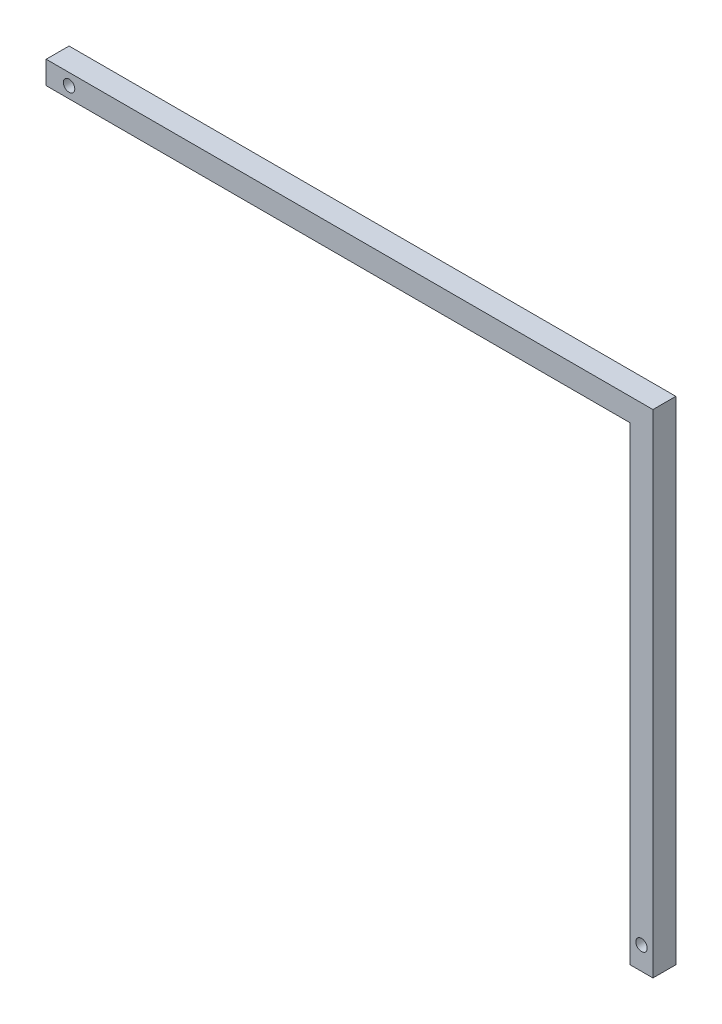
ISO-10303-21;
HEADER;
FILE_DESCRIPTION(('STEP AP214'),'2;1');
FILE_NAME('part.step','',(''),(''),'','','');
FILE_SCHEMA(('AUTOMOTIVE_DESIGN { 1 0 10303 214 1 1 1 1 }'));
ENDSEC;
DATA;
#1=APPLICATION_CONTEXT('core data for automotive mechanical design processes');
#2=APPLICATION_PROTOCOL_DEFINITION('international standard','automotive_design',2000,#1);
#3=PRODUCT_CONTEXT('',#1,'mechanical');
#4=PRODUCT('Part','Part','',(#3));
#5=PRODUCT_RELATED_PRODUCT_CATEGORY('part','',(#4));
#6=PRODUCT_DEFINITION_FORMATION('','',#4);
#7=PRODUCT_DEFINITION_CONTEXT('part definition',#1,'design');
#8=PRODUCT_DEFINITION('design','',#6,#7);
#9=PRODUCT_DEFINITION_SHAPE('','',#8);
#10=(LENGTH_UNIT() NAMED_UNIT(*) SI_UNIT(.MILLI.,.METRE.));
#11=(NAMED_UNIT(*) PLANE_ANGLE_UNIT() SI_UNIT($,.RADIAN.));
#12=(NAMED_UNIT(*) SI_UNIT($,.STERADIAN.) SOLID_ANGLE_UNIT());
#13=UNCERTAINTY_MEASURE_WITH_UNIT(LENGTH_MEASURE(1.E-05),#10,'distance_accuracy_value','');
#14=(GEOMETRIC_REPRESENTATION_CONTEXT(3) GLOBAL_UNCERTAINTY_ASSIGNED_CONTEXT((#13)) GLOBAL_UNIT_ASSIGNED_CONTEXT((#10,
#11,#12)) REPRESENTATION_CONTEXT('',''));
#15=CARTESIAN_POINT('',(0.,0.,0.));
#16=DIRECTION('',(0.,0.,1.));
#17=DIRECTION('',(1.,0.,0.));
#18=AXIS2_PLACEMENT_3D('',#15,#16,#17);
#19=CARTESIAN_POINT('',(0.,0.,0.));
#20=DIRECTION('',(0.,0.,1.));
#21=DIRECTION('',(1.,0.,0.));
#22=AXIS2_PLACEMENT_3D('',#19,#20,#21);
#23=PLANE('',#22);
#24=CARTESIAN_POINT('',(255.,-400.,0.));
#25=DIRECTION('',(0.,0.,1.));
#26=DIRECTION('',(1.,0.,0.));
#27=AXIS2_PLACEMENT_3D('',#24,#25,#26);
#28=CIRCLE('',#27,4.99999999999999);
#29=CARTESIAN_POINT('',(260.,-400.,0.));
#30=VERTEX_POINT('',#29);
#31=EDGE_CURVE('E138',#30,#30,#28,.T.);
#32=ORIENTED_EDGE('',*,*,#31,.T.);
#33=EDGE_LOOP('',(#32));
#34=FACE_BOUND('',#33,.T.);
#35=DIRECTION('',(0.,1.,0.));
#36=VECTOR('',#35,1.);
#37=CARTESIAN_POINT('',(265.,-10.,0.));
#38=LINE('',#37,#36);
#39=CARTESIAN_POINT('',(265.,-420.,0.));
#40=VERTEX_POINT('',#39);
#41=CARTESIAN_POINT('',(265.,10.,0.));
#42=VERTEX_POINT('',#41);
#43=EDGE_CURVE('E114',#40,#42,#38,.T.);
#44=ORIENTED_EDGE('',*,*,#43,.F.);
#45=DIRECTION('',(-1.,0.,0.));
#46=VECTOR('',#45,1.);
#47=CARTESIAN_POINT('',(265.,-420.,0.));
#48=LINE('',#47,#46);
#49=CARTESIAN_POINT('',(245.,-420.,0.));
#50=VERTEX_POINT('',#49);
#51=EDGE_CURVE('E128',#40,#50,#48,.T.);
#52=ORIENTED_EDGE('',*,*,#51,.T.);
#53=DIRECTION('',(0.,-1.,0.));
#54=VECTOR('',#53,1.);
#55=CARTESIAN_POINT('',(245.,10.,0.));
#56=LINE('',#55,#54);
#57=CARTESIAN_POINT('',(245.,-10.,0.));
#58=VERTEX_POINT('',#57);
#59=EDGE_CURVE('E120',#58,#50,#56,.T.);
#60=ORIENTED_EDGE('',*,*,#59,.F.);
#61=DIRECTION('',(1.,0.,0.));
#62=VECTOR('',#61,1.);
#63=CARTESIAN_POINT('',(-265.,-10.,0.));
#64=LINE('',#63,#62);
#65=CARTESIAN_POINT('',(-265.,-10.,0.));
#66=VERTEX_POINT('',#65);
#67=EDGE_CURVE('E167',#66,#58,#64,.T.);
#68=ORIENTED_EDGE('',*,*,#67,.F.);
#69=DIRECTION('',(0.,1.,0.));
#70=VECTOR('',#69,1.);
#71=CARTESIAN_POINT('',(-265.,-10.,0.));
#72=LINE('',#71,#70);
#73=CARTESIAN_POINT('',(-265.,10.,0.));
#74=VERTEX_POINT('',#73);
#75=EDGE_CURVE('E162',#66,#74,#72,.T.);
#76=ORIENTED_EDGE('',*,*,#75,.T.);
#77=DIRECTION('',(1.,0.,0.));
#78=VECTOR('',#77,1.);
#79=CARTESIAN_POINT('',(-265.,10.,0.));
#80=LINE('',#79,#78);
#81=EDGE_CURVE('E172',#74,#42,#80,.T.);
#82=ORIENTED_EDGE('',*,*,#81,.T.);
#83=EDGE_LOOP('',(#44,#52,#60,#68,#76,#82));
#84=FACE_BOUND('',#83,.T.);
#85=CARTESIAN_POINT('',(-245.,0.,0.));
#86=DIRECTION('',(0.,0.,1.));
#87=DIRECTION('',(1.,0.,0.));
#88=AXIS2_PLACEMENT_3D('',#85,#86,#87);
#89=CIRCLE('',#88,5.00000000000002);
#90=CARTESIAN_POINT('',(-240.,0.,0.));
#91=VERTEX_POINT('',#90);
#92=EDGE_CURVE('E135',#91,#91,#89,.T.);
#93=ORIENTED_EDGE('',*,*,#92,.T.);
#94=EDGE_LOOP('',(#93));
#95=FACE_BOUND('',#94,.T.);
#96=ADVANCED_FACE('F78',(#34,#84,#95),#23,.F.);
#97=CARTESIAN_POINT('',(265.,-10.,20.));
#98=DIRECTION('',(-1.,0.,0.));
#99=DIRECTION('',(0.,0.,1.));
#100=AXIS2_PLACEMENT_3D('',#97,#98,#99);
#101=PLANE('',#100);
#102=ORIENTED_EDGE('',*,*,#43,.T.);
#103=DIRECTION('',(0.,0.,-1.));
#104=VECTOR('',#103,1.);
#105=CARTESIAN_POINT('',(265.,10.,20.));
#106=LINE('',#105,#104);
#107=CARTESIAN_POINT('',(265.,10.,20.));
#108=VERTEX_POINT('',#107);
#109=EDGE_CURVE('E150',#108,#42,#106,.T.);
#110=ORIENTED_EDGE('',*,*,#109,.F.);
#111=DIRECTION('',(0.,1.,0.));
#112=VECTOR('',#111,1.);
#113=CARTESIAN_POINT('',(265.,-10.,20.));
#114=LINE('',#113,#112);
#115=CARTESIAN_POINT('',(265.,-420.,20.));
#116=VERTEX_POINT('',#115);
#117=EDGE_CURVE('E183',#116,#108,#114,.T.);
#118=ORIENTED_EDGE('',*,*,#117,.F.);
#119=DIRECTION('',(0.,0.,-1.));
#120=VECTOR('',#119,1.);
#121=CARTESIAN_POINT('',(265.,-420.,20.));
#122=LINE('',#121,#120);
#123=EDGE_CURVE('E82',#116,#40,#122,.T.);
#124=ORIENTED_EDGE('',*,*,#123,.T.);
#125=EDGE_LOOP('',(#102,#110,#118,#124));
#126=FACE_BOUND('',#125,.T.);
#127=ADVANCED_FACE('F206',(#126),#101,.F.);
#128=CARTESIAN_POINT('',(0.,0.,20.));
#129=DIRECTION('',(0.,0.,1.));
#130=DIRECTION('',(1.,0.,0.));
#131=AXIS2_PLACEMENT_3D('',#128,#129,#130);
#132=PLANE('',#131);
#133=CARTESIAN_POINT('',(255.,-400.,20.));
#134=DIRECTION('',(0.,0.,1.));
#135=DIRECTION('',(1.,0.,0.));
#136=AXIS2_PLACEMENT_3D('',#133,#134,#135);
#137=CIRCLE('',#136,4.99999999999999);
#138=CARTESIAN_POINT('',(260.,-400.,20.));
#139=VERTEX_POINT('',#138);
#140=EDGE_CURVE('E142',#139,#139,#137,.T.);
#141=ORIENTED_EDGE('',*,*,#140,.F.);
#142=EDGE_LOOP('',(#141));
#143=FACE_BOUND('',#142,.T.);
#144=ORIENTED_EDGE('',*,*,#117,.T.);
#145=DIRECTION('',(1.,0.,0.));
#146=VECTOR('',#145,1.);
#147=CARTESIAN_POINT('',(-265.,10.,20.));
#148=LINE('',#147,#146);
#149=CARTESIAN_POINT('',(-265.,10.,20.));
#150=VERTEX_POINT('',#149);
#151=EDGE_CURVE('E166',#150,#108,#148,.T.);
#152=ORIENTED_EDGE('',*,*,#151,.F.);
#153=DIRECTION('',(0.,1.,0.));
#154=VECTOR('',#153,1.);
#155=CARTESIAN_POINT('',(-265.,-10.,20.));
#156=LINE('',#155,#154);
#157=CARTESIAN_POINT('',(-265.,-10.,20.));
#158=VERTEX_POINT('',#157);
#159=EDGE_CURVE('E155',#158,#150,#156,.T.);
#160=ORIENTED_EDGE('',*,*,#159,.F.);
#161=DIRECTION('',(1.,0.,0.));
#162=VECTOR('',#161,1.);
#163=CARTESIAN_POINT('',(-265.,-10.,20.));
#164=LINE('',#163,#162);
#165=CARTESIAN_POINT('',(245.,-10.,20.));
#166=VERTEX_POINT('',#165);
#167=EDGE_CURVE('E179',#158,#166,#164,.T.);
#168=ORIENTED_EDGE('',*,*,#167,.T.);
#169=DIRECTION('',(0.,-1.,0.));
#170=VECTOR('',#169,1.);
#171=CARTESIAN_POINT('',(245.,10.,20.));
#172=LINE('',#171,#170);
#173=CARTESIAN_POINT('',(245.,-420.,20.));
#174=VERTEX_POINT('',#173);
#175=EDGE_CURVE('E145',#166,#174,#172,.T.);
#176=ORIENTED_EDGE('',*,*,#175,.T.);
#177=DIRECTION('',(-1.,0.,0.));
#178=VECTOR('',#177,1.);
#179=CARTESIAN_POINT('',(265.,-420.,20.));
#180=LINE('',#179,#178);
#181=EDGE_CURVE('E127',#116,#174,#180,.T.);
#182=ORIENTED_EDGE('',*,*,#181,.F.);
#183=EDGE_LOOP('',(#144,#152,#160,#168,#176,#182));
#184=FACE_BOUND('',#183,.T.);
#185=CARTESIAN_POINT('',(-245.,0.,20.));
#186=DIRECTION('',(0.,0.,1.));
#187=DIRECTION('',(1.,0.,0.));
#188=AXIS2_PLACEMENT_3D('',#185,#186,#187);
#189=CIRCLE('',#188,5.00000000000002);
#190=CARTESIAN_POINT('',(-240.,0.,20.));
#191=VERTEX_POINT('',#190);
#192=EDGE_CURVE('E175',#191,#191,#189,.T.);
#193=ORIENTED_EDGE('',*,*,#192,.F.);
#194=EDGE_LOOP('',(#193));
#195=FACE_BOUND('',#194,.T.);
#196=ADVANCED_FACE('F202',(#143,#184,#195),#132,.T.);
#197=CARTESIAN_POINT('',(-265.,10.,20.));
#198=DIRECTION('',(0.,1.,0.));
#199=DIRECTION('',(0.,0.,1.));
#200=AXIS2_PLACEMENT_3D('',#197,#198,#199);
#201=PLANE('',#200);
#202=ORIENTED_EDGE('',*,*,#109,.T.);
#203=ORIENTED_EDGE('',*,*,#81,.F.);
#204=DIRECTION('',(0.,0.,-1.));
#205=VECTOR('',#204,1.);
#206=CARTESIAN_POINT('',(-265.,10.,20.));
#207=LINE('',#206,#205);
#208=EDGE_CURVE('E89',#150,#74,#207,.T.);
#209=ORIENTED_EDGE('',*,*,#208,.F.);
#210=ORIENTED_EDGE('',*,*,#151,.T.);
#211=EDGE_LOOP('',(#202,#203,#209,#210));
#212=FACE_BOUND('',#211,.T.);
#213=ADVANCED_FACE('F205',(#212),#201,.T.);
#214=CARTESIAN_POINT('',(245.,10.,20.));
#215=DIRECTION('',(1.,0.,0.));
#216=DIRECTION('',(0.,1.,0.));
#217=AXIS2_PLACEMENT_3D('',#214,#215,#216);
#218=PLANE('',#217);
#219=ORIENTED_EDGE('',*,*,#175,.F.);
#220=DIRECTION('',(0.,0.,-1.));
#221=VECTOR('',#220,1.);
#222=CARTESIAN_POINT('',(245.,-10.,20.));
#223=LINE('',#222,#221);
#224=EDGE_CURVE('E12',#166,#58,#223,.T.);
#225=ORIENTED_EDGE('',*,*,#224,.T.);
#226=ORIENTED_EDGE('',*,*,#59,.T.);
#227=DIRECTION('',(0.,0.,-1.));
#228=VECTOR('',#227,1.);
#229=CARTESIAN_POINT('',(245.,-420.,20.));
#230=LINE('',#229,#228);
#231=EDGE_CURVE('E123',#174,#50,#230,.T.);
#232=ORIENTED_EDGE('',*,*,#231,.F.);
#233=EDGE_LOOP('',(#219,#225,#226,#232));
#234=FACE_BOUND('',#233,.T.);
#235=ADVANCED_FACE('F122',(#234),#218,.F.);
#236=CARTESIAN_POINT('',(265.,-420.,20.));
#237=DIRECTION('',(0.,-1.,0.));
#238=DIRECTION('',(0.,0.,-1.));
#239=AXIS2_PLACEMENT_3D('',#236,#237,#238);
#240=PLANE('',#239);
#241=ORIENTED_EDGE('',*,*,#51,.F.);
#242=ORIENTED_EDGE('',*,*,#123,.F.);
#243=ORIENTED_EDGE('',*,*,#181,.T.);
#244=ORIENTED_EDGE('',*,*,#231,.T.);
#245=EDGE_LOOP('',(#241,#242,#243,#244));
#246=FACE_BOUND('',#245,.T.);
#247=ADVANCED_FACE('F80',(#246),#240,.T.);
#248=CARTESIAN_POINT('',(-265.,-10.,20.));
#249=DIRECTION('',(0.,1.,0.));
#250=DIRECTION('',(0.,0.,1.));
#251=AXIS2_PLACEMENT_3D('',#248,#249,#250);
#252=PLANE('',#251);
#253=ORIENTED_EDGE('',*,*,#224,.F.);
#254=ORIENTED_EDGE('',*,*,#167,.F.);
#255=DIRECTION('',(0.,0.,-1.));
#256=VECTOR('',#255,1.);
#257=CARTESIAN_POINT('',(-265.,-10.,20.));
#258=LINE('',#257,#256);
#259=EDGE_CURVE('E154',#158,#66,#258,.T.);
#260=ORIENTED_EDGE('',*,*,#259,.T.);
#261=ORIENTED_EDGE('',*,*,#67,.T.);
#262=EDGE_LOOP('',(#253,#254,#260,#261));
#263=FACE_BOUND('',#262,.T.);
#264=ADVANCED_FACE('F231',(#263),#252,.F.);
#265=CARTESIAN_POINT('',(-265.,-10.,20.));
#266=DIRECTION('',(-1.,0.,0.));
#267=DIRECTION('',(0.,0.,1.));
#268=AXIS2_PLACEMENT_3D('',#265,#266,#267);
#269=PLANE('',#268);
#270=ORIENTED_EDGE('',*,*,#75,.F.);
#271=ORIENTED_EDGE('',*,*,#259,.F.);
#272=ORIENTED_EDGE('',*,*,#159,.T.);
#273=ORIENTED_EDGE('',*,*,#208,.T.);
#274=EDGE_LOOP('',(#270,#271,#272,#273));
#275=FACE_BOUND('',#274,.T.);
#276=ADVANCED_FACE('F217',(#275),#269,.T.);
#277=CARTESIAN_POINT('',(-245.,0.,20.));
#278=DIRECTION('',(0.,0.,-1.));
#279=DIRECTION('',(-1.,0.,0.));
#280=AXIS2_PLACEMENT_3D('',#277,#278,#279);
#281=CYLINDRICAL_SURFACE('',#280,5.00000000000002);
#282=ORIENTED_EDGE('',*,*,#192,.T.);
#283=EDGE_LOOP('',(#282));
#284=FACE_BOUND('',#283,.T.);
#285=ORIENTED_EDGE('',*,*,#92,.F.);
#286=EDGE_LOOP('',(#285));
#287=FACE_BOUND('',#286,.T.);
#288=ADVANCED_FACE('F214',(#284,#287),#281,.F.);
#289=CARTESIAN_POINT('',(255.,-400.,0.));
#290=DIRECTION('',(0.,0.,1.));
#291=DIRECTION('',(1.,0.,0.));
#292=AXIS2_PLACEMENT_3D('',#289,#290,#291);
#293=CYLINDRICAL_SURFACE('',#292,4.99999999999999);
#294=ORIENTED_EDGE('',*,*,#31,.F.);
#295=EDGE_LOOP('',(#294));
#296=FACE_BOUND('',#295,.T.);
#297=ORIENTED_EDGE('',*,*,#140,.T.);
#298=EDGE_LOOP('',(#297));
#299=FACE_BOUND('',#298,.T.);
#300=ADVANCED_FACE('F200',(#296,#299),#293,.F.);
#301=CLOSED_SHELL('',(#96,#127,#196,#213,#235,#247,#264,#276,#288,#300));
#302=MANIFOLD_SOLID_BREP('B2',#301);
#303=ADVANCED_BREP_SHAPE_REPRESENTATION('',(#18,#302),#14);
#304=SHAPE_DEFINITION_REPRESENTATION(#9,#303);
ENDSEC;
END-ISO-10303-21;
